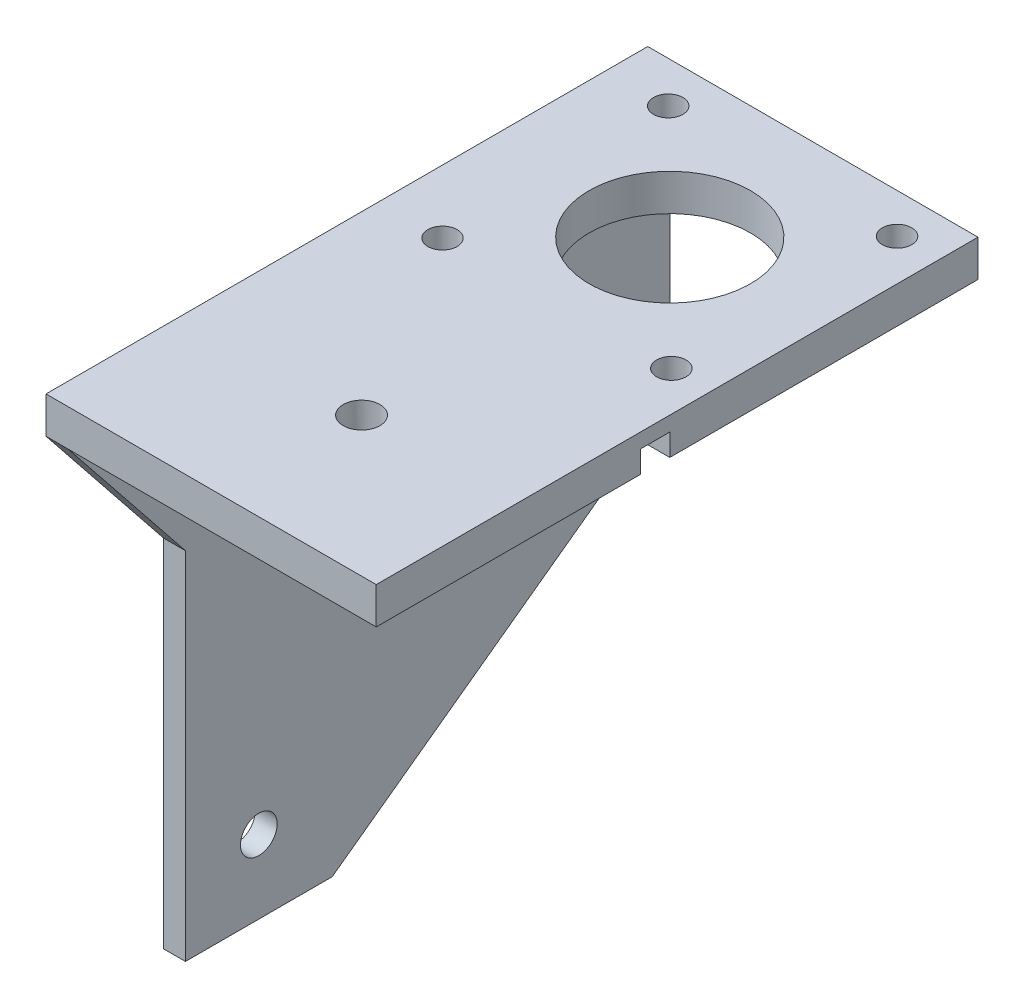
ISO-10303-21;
HEADER;
FILE_DESCRIPTION(('STEP AP214'),'2;1');
FILE_NAME('part.step','',(''),(''),'','','');
FILE_SCHEMA(('AUTOMOTIVE_DESIGN { 1 0 10303 214 1 1 1 1 }'));
ENDSEC;
DATA;
#1=APPLICATION_CONTEXT('core data for automotive mechanical design processes');
#2=APPLICATION_PROTOCOL_DEFINITION('international standard','automotive_design',2000,#1);
#3=PRODUCT_CONTEXT('',#1,'mechanical');
#4=PRODUCT('Part','Part','',(#3));
#5=PRODUCT_RELATED_PRODUCT_CATEGORY('part','',(#4));
#6=PRODUCT_DEFINITION_FORMATION('','',#4);
#7=PRODUCT_DEFINITION_CONTEXT('part definition',#1,'design');
#8=PRODUCT_DEFINITION('design','',#6,#7);
#9=PRODUCT_DEFINITION_SHAPE('','',#8);
#10=(LENGTH_UNIT() NAMED_UNIT(*) SI_UNIT(.MILLI.,.METRE.));
#11=(NAMED_UNIT(*) PLANE_ANGLE_UNIT() SI_UNIT($,.RADIAN.));
#12=(NAMED_UNIT(*) SI_UNIT($,.STERADIAN.) SOLID_ANGLE_UNIT());
#13=UNCERTAINTY_MEASURE_WITH_UNIT(LENGTH_MEASURE(1.E-05),#10,'distance_accuracy_value','');
#14=(GEOMETRIC_REPRESENTATION_CONTEXT(3) GLOBAL_UNCERTAINTY_ASSIGNED_CONTEXT((#13)) GLOBAL_UNIT_ASSIGNED_CONTEXT((#10,
#11,#12)) REPRESENTATION_CONTEXT('',''));
#15=CARTESIAN_POINT('',(0.,0.,0.));
#16=DIRECTION('',(0.,0.,1.));
#17=DIRECTION('',(1.,0.,0.));
#18=AXIS2_PLACEMENT_3D('',#15,#16,#17);
#19=CARTESIAN_POINT('',(0.,0.,-42.));
#20=DIRECTION('',(0.,-1.,0.));
#21=DIRECTION('',(0.,0.,1.));
#22=AXIS2_PLACEMENT_3D('',#19,#20,#21);
#23=PLANE('',#22);
#24=DIRECTION('',(-1.,0.,0.));
#25=VECTOR('',#24,1.);
#26=CARTESIAN_POINT('',(-21.,0.,-17.));
#27=LINE('',#26,#25);
#28=CARTESIAN_POINT('',(21.,0.,-17.));
#29=VERTEX_POINT('',#28);
#30=CARTESIAN_POINT('',(-21.,0.,-17.));
#31=VERTEX_POINT('',#30);
#32=EDGE_CURVE('E157',#29,#31,#27,.T.);
#33=ORIENTED_EDGE('',*,*,#32,.F.);
#34=DIRECTION('',(0.,0.,1.));
#35=VECTOR('',#34,1.);
#36=CARTESIAN_POINT('',(21.,0.,-63.));
#37=LINE('',#36,#35);
#38=CARTESIAN_POINT('',(21.,0.,19.));
#39=VERTEX_POINT('',#38);
#40=EDGE_CURVE('E83',#29,#39,#37,.T.);
#41=ORIENTED_EDGE('',*,*,#40,.T.);
#42=DIRECTION('',(1.,0.,0.));
#43=VECTOR('',#42,1.);
#44=CARTESIAN_POINT('',(-21.,0.,19.));
#45=LINE('',#44,#43);
#46=CARTESIAN_POINT('',(-21.,0.,19.));
#47=VERTEX_POINT('',#46);
#48=EDGE_CURVE('E220',#47,#39,#45,.T.);
#49=ORIENTED_EDGE('',*,*,#48,.F.);
#50=DIRECTION('',(0.,0.,-1.));
#51=VECTOR('',#50,1.);
#52=CARTESIAN_POINT('',(-21.,0.,-63.));
#53=LINE('',#52,#51);
#54=EDGE_CURVE('E263',#47,#31,#53,.T.);
#55=ORIENTED_EDGE('',*,*,#54,.T.);
#56=EDGE_LOOP('',(#33,#41,#49,#55));
#57=FACE_BOUND('',#56,.T.);
#58=CARTESIAN_POINT('',(0.,0.,0.));
#59=DIRECTION('',(0.,-1.,0.));
#60=DIRECTION('',(0.,0.,-1.));
#61=AXIS2_PLACEMENT_3D('',#58,#59,#60);
#62=CIRCLE('',#61,2.5);
#63=CARTESIAN_POINT('',(0.,0.,-2.5));
#64=VERTEX_POINT('',#63);
#65=EDGE_CURVE('E168',#64,#64,#62,.T.);
#66=ORIENTED_EDGE('',*,*,#65,.F.);
#67=EDGE_LOOP('',(#66));
#68=FACE_BOUND('',#67,.T.);
#69=ADVANCED_FACE('F34',(#57,#68),#23,.T.);
#70=CARTESIAN_POINT('',(0.,5.,-42.));
#71=DIRECTION('',(0.,-1.,0.));
#72=DIRECTION('',(0.,0.,1.));
#73=AXIS2_PLACEMENT_3D('',#70,#71,#72);
#74=PLANE('',#73);
#75=CARTESIAN_POINT('',(0.,5.,0.));
#76=DIRECTION('',(0.,1.,0.));
#77=DIRECTION('',(0.,0.,1.));
#78=AXIS2_PLACEMENT_3D('',#75,#76,#77);
#79=CIRCLE('',#78,2.5);
#80=CARTESIAN_POINT('',(0.,5.,2.5));
#81=VERTEX_POINT('',#80);
#82=EDGE_CURVE('E164',#81,#81,#79,.T.);
#83=ORIENTED_EDGE('',*,*,#82,.F.);
#84=EDGE_LOOP('',(#83));
#85=FACE_BOUND('',#84,.T.);
#86=DIRECTION('',(0.,0.,1.));
#87=VECTOR('',#86,1.);
#88=CARTESIAN_POINT('',(21.,5.,-63.));
#89=LINE('',#88,#87);
#90=CARTESIAN_POINT('',(21.,5.,-63.));
#91=VERTEX_POINT('',#90);
#92=CARTESIAN_POINT('',(21.,5.,19.));
#93=VERTEX_POINT('',#92);
#94=EDGE_CURVE('E75',#91,#93,#89,.T.);
#95=ORIENTED_EDGE('',*,*,#94,.F.);
#96=DIRECTION('',(1.,0.,0.));
#97=VECTOR('',#96,1.);
#98=CARTESIAN_POINT('',(-21.,5.,-63.));
#99=LINE('',#98,#97);
#100=CARTESIAN_POINT('',(-24.,5.,-63.));
#101=VERTEX_POINT('',#100);
#102=EDGE_CURVE('E257',#101,#91,#99,.T.);
#103=ORIENTED_EDGE('',*,*,#102,.F.);
#104=DIRECTION('',(0.,0.,-1.));
#105=VECTOR('',#104,1.);
#106=CARTESIAN_POINT('',(-24.,5.,19.));
#107=LINE('',#106,#105);
#108=CARTESIAN_POINT('',(-24.,5.,19.));
#109=VERTEX_POINT('',#108);
#110=EDGE_CURVE('E177',#109,#101,#107,.T.);
#111=ORIENTED_EDGE('',*,*,#110,.F.);
#112=DIRECTION('',(-1.,0.,0.));
#113=VECTOR('',#112,1.);
#114=CARTESIAN_POINT('',(-21.,5.,19.));
#115=LINE('',#114,#113);
#116=EDGE_CURVE('E224',#93,#109,#115,.T.);
#117=ORIENTED_EDGE('',*,*,#116,.F.);
#118=EDGE_LOOP('',(#95,#103,#111,#117));
#119=FACE_BOUND('',#118,.T.);
#120=CARTESIAN_POINT('',(0.,5.,-42.));
#121=DIRECTION('',(0.,-1.,0.));
#122=DIRECTION('',(0.,0.,-1.));
#123=AXIS2_PLACEMENT_3D('',#120,#121,#122);
#124=CIRCLE('',#123,11.);
#125=CARTESIAN_POINT('',(0.,5.,-53.));
#126=VERTEX_POINT('',#125);
#127=EDGE_CURVE('E251',#126,#126,#124,.T.);
#128=ORIENTED_EDGE('',*,*,#127,.T.);
#129=EDGE_LOOP('',(#128));
#130=FACE_BOUND('',#129,.T.);
#131=CARTESIAN_POINT('',(-15.592519129157,5.,-57.3780150606921));
#132=DIRECTION('',(0.,-1.,0.));
#133=DIRECTION('',(0.,0.,-1.));
#134=AXIS2_PLACEMENT_3D('',#131,#132,#133);
#135=CIRCLE('',#134,2.);
#136=CARTESIAN_POINT('',(-15.592519129157,5.,-59.3780150606921));
#137=VERTEX_POINT('',#136);
#138=EDGE_CURVE('E245',#137,#137,#135,.T.);
#139=ORIENTED_EDGE('',*,*,#138,.T.);
#140=EDGE_LOOP('',(#139));
#141=FACE_BOUND('',#140,.T.);
#142=CARTESIAN_POINT('',(-15.3780150606921,5.,-26.407480870843));
#143=DIRECTION('',(0.,-1.,0.));
#144=DIRECTION('',(0.,0.,-1.));
#145=AXIS2_PLACEMENT_3D('',#142,#143,#144);
#146=CIRCLE('',#145,2.);
#147=CARTESIAN_POINT('',(-15.3780150606921,5.,-28.407480870843));
#148=VERTEX_POINT('',#147);
#149=EDGE_CURVE('E239',#148,#148,#146,.T.);
#150=ORIENTED_EDGE('',*,*,#149,.T.);
#151=EDGE_LOOP('',(#150));
#152=FACE_BOUND('',#151,.T.);
#153=CARTESIAN_POINT('',(15.592519129157,5.,-26.6219849393079));
#154=DIRECTION('',(0.,-1.,0.));
#155=DIRECTION('',(0.,0.,-1.));
#156=AXIS2_PLACEMENT_3D('',#153,#154,#155);
#157=CIRCLE('',#156,2.);
#158=CARTESIAN_POINT('',(15.592519129157,5.,-28.6219849393079));
#159=VERTEX_POINT('',#158);
#160=EDGE_CURVE('E233',#159,#159,#157,.T.);
#161=ORIENTED_EDGE('',*,*,#160,.T.);
#162=EDGE_LOOP('',(#161));
#163=FACE_BOUND('',#162,.T.);
#164=CARTESIAN_POINT('',(15.3780150606921,5.,-57.592519129157));
#165=DIRECTION('',(0.,-1.,0.));
#166=DIRECTION('',(0.,0.,-1.));
#167=AXIS2_PLACEMENT_3D('',#164,#165,#166);
#168=CIRCLE('',#167,2.);
#169=CARTESIAN_POINT('',(15.3780150606921,5.,-59.592519129157));
#170=VERTEX_POINT('',#169);
#171=EDGE_CURVE('E227',#170,#170,#168,.T.);
#172=ORIENTED_EDGE('',*,*,#171,.T.);
#173=EDGE_LOOP('',(#172));
#174=FACE_BOUND('',#173,.T.);
#175=ADVANCED_FACE('F285',(#85,#119,#130,#141,#152,#163,#174),#74,.F.);
#176=DIRECTION('',(1.,0.,0.));
#177=VECTOR('',#176,1.);
#178=CARTESIAN_POINT('',(-21.,0.,-21.));
#179=LINE('',#178,#177);
#180=CARTESIAN_POINT('',(-21.,0.,-21.));
#181=VERTEX_POINT('',#180);
#182=CARTESIAN_POINT('',(21.,0.,-21.));
#183=VERTEX_POINT('',#182);
#184=EDGE_CURVE('E159',#181,#183,#179,.T.);
#185=ORIENTED_EDGE('',*,*,#184,.F.);
#186=CARTESIAN_POINT('',(-21.,0.,-63.));
#187=VERTEX_POINT('',#186);
#188=EDGE_CURVE('E70',#181,#187,#53,.T.);
#189=ORIENTED_EDGE('',*,*,#188,.T.);
#190=DIRECTION('',(1.,0.,0.));
#191=VECTOR('',#190,1.);
#192=CARTESIAN_POINT('',(-21.,0.,-63.));
#193=LINE('',#192,#191);
#194=CARTESIAN_POINT('',(21.,0.,-63.));
#195=VERTEX_POINT('',#194);
#196=EDGE_CURVE('E258',#187,#195,#193,.T.);
#197=ORIENTED_EDGE('',*,*,#196,.T.);
#198=EDGE_CURVE('E260',#195,#183,#37,.T.);
#199=ORIENTED_EDGE('',*,*,#198,.T.);
#200=EDGE_LOOP('',(#185,#189,#197,#199));
#201=FACE_BOUND('',#200,.T.);
#202=CARTESIAN_POINT('',(15.592519129157,0.,-26.6219849393079));
#203=DIRECTION('',(0.,-1.,0.));
#204=DIRECTION('',(0.,0.,-1.));
#205=AXIS2_PLACEMENT_3D('',#202,#203,#204);
#206=CIRCLE('',#205,2.);
#207=CARTESIAN_POINT('',(15.592519129157,0.,-28.6219849393079));
#208=VERTEX_POINT('',#207);
#209=EDGE_CURVE('E230',#208,#208,#206,.T.);
#210=ORIENTED_EDGE('',*,*,#209,.F.);
#211=EDGE_LOOP('',(#210));
#212=FACE_BOUND('',#211,.T.);
#213=CARTESIAN_POINT('',(-15.592519129157,0.,-57.3780150606921));
#214=DIRECTION('',(0.,-1.,0.));
#215=DIRECTION('',(0.,0.,-1.));
#216=AXIS2_PLACEMENT_3D('',#213,#214,#215);
#217=CIRCLE('',#216,2.);
#218=CARTESIAN_POINT('',(-15.592519129157,0.,-59.3780150606921));
#219=VERTEX_POINT('',#218);
#220=EDGE_CURVE('E242',#219,#219,#217,.T.);
#221=ORIENTED_EDGE('',*,*,#220,.F.);
#222=EDGE_LOOP('',(#221));
#223=FACE_BOUND('',#222,.T.);
#224=CARTESIAN_POINT('',(0.,0.,-42.));
#225=DIRECTION('',(0.,-1.,0.));
#226=DIRECTION('',(0.,0.,-1.));
#227=AXIS2_PLACEMENT_3D('',#224,#225,#226);
#228=CIRCLE('',#227,11.);
#229=CARTESIAN_POINT('',(0.,0.,-53.));
#230=VERTEX_POINT('',#229);
#231=EDGE_CURVE('E248',#230,#230,#228,.T.);
#232=ORIENTED_EDGE('',*,*,#231,.F.);
#233=EDGE_LOOP('',(#232));
#234=FACE_BOUND('',#233,.T.);
#235=CARTESIAN_POINT('',(-15.3780150606921,0.,-26.407480870843));
#236=DIRECTION('',(0.,-1.,0.));
#237=DIRECTION('',(0.,0.,-1.));
#238=AXIS2_PLACEMENT_3D('',#235,#236,#237);
#239=CIRCLE('',#238,2.);
#240=CARTESIAN_POINT('',(-15.3780150606921,0.,-28.407480870843));
#241=VERTEX_POINT('',#240);
#242=EDGE_CURVE('E236',#241,#241,#239,.T.);
#243=ORIENTED_EDGE('',*,*,#242,.F.);
#244=EDGE_LOOP('',(#243));
#245=FACE_BOUND('',#244,.T.);
#246=CARTESIAN_POINT('',(15.3780150606921,0.,-57.592519129157));
#247=DIRECTION('',(0.,-1.,0.));
#248=DIRECTION('',(0.,0.,-1.));
#249=AXIS2_PLACEMENT_3D('',#246,#247,#248);
#250=CIRCLE('',#249,2.);
#251=CARTESIAN_POINT('',(15.3780150606921,0.,-59.592519129157));
#252=VERTEX_POINT('',#251);
#253=EDGE_CURVE('E226',#252,#252,#250,.T.);
#254=ORIENTED_EDGE('',*,*,#253,.F.);
#255=EDGE_LOOP('',(#254));
#256=FACE_BOUND('',#255,.T.);
#257=ADVANCED_FACE('F275',(#201,#212,#223,#234,#245,#256),#23,.T.);
#258=CARTESIAN_POINT('',(21.,5.,-63.));
#259=DIRECTION('',(-1.,0.,0.));
#260=DIRECTION('',(0.,0.,-1.));
#261=AXIS2_PLACEMENT_3D('',#258,#259,#260);
#262=PLANE('',#261);
#263=ORIENTED_EDGE('',*,*,#40,.F.);
#264=DIRECTION('',(0.,1.,0.));
#265=VECTOR('',#264,1.);
#266=CARTESIAN_POINT('',(21.,5.,-17.));
#267=LINE('',#266,#265);
#268=CARTESIAN_POINT('',(21.,3.,-17.));
#269=VERTEX_POINT('',#268);
#270=EDGE_CURVE('E11',#29,#269,#267,.T.);
#271=ORIENTED_EDGE('',*,*,#270,.T.);
#272=DIRECTION('',(0.,0.,-1.));
#273=VECTOR('',#272,1.);
#274=CARTESIAN_POINT('',(21.,3.,-63.));
#275=LINE('',#274,#273);
#276=CARTESIAN_POINT('',(21.,3.,-21.));
#277=VERTEX_POINT('',#276);
#278=EDGE_CURVE('E268',#269,#277,#275,.T.);
#279=ORIENTED_EDGE('',*,*,#278,.T.);
#280=DIRECTION('',(0.,-1.,0.));
#281=VECTOR('',#280,1.);
#282=CARTESIAN_POINT('',(21.,5.,-21.));
#283=LINE('',#282,#281);
#284=EDGE_CURVE('E42',#277,#183,#283,.T.);
#285=ORIENTED_EDGE('',*,*,#284,.T.);
#286=ORIENTED_EDGE('',*,*,#198,.F.);
#287=DIRECTION('',(0.,-1.,0.));
#288=VECTOR('',#287,1.);
#289=CARTESIAN_POINT('',(21.,5.,-63.));
#290=LINE('',#289,#288);
#291=EDGE_CURVE('E58',#91,#195,#290,.T.);
#292=ORIENTED_EDGE('',*,*,#291,.F.);
#293=ORIENTED_EDGE('',*,*,#94,.T.);
#294=DIRECTION('',(0.,1.,0.));
#295=VECTOR('',#294,1.);
#296=CARTESIAN_POINT('',(21.,5.,19.));
#297=LINE('',#296,#295);
#298=EDGE_CURVE('E222',#39,#93,#297,.T.);
#299=ORIENTED_EDGE('',*,*,#298,.F.);
#300=EDGE_LOOP('',(#263,#271,#279,#285,#286,#292,#293,#299));
#301=FACE_BOUND('',#300,.T.);
#302=ADVANCED_FACE('F36',(#301),#262,.F.);
#303=CARTESIAN_POINT('',(-21.,5.,-63.));
#304=DIRECTION('',(0.,0.,1.));
#305=DIRECTION('',(-1.,0.,0.));
#306=AXIS2_PLACEMENT_3D('',#303,#304,#305);
#307=PLANE('',#306);
#308=ORIENTED_EDGE('',*,*,#196,.F.);
#309=DIRECTION('',(0.,-1.,0.));
#310=VECTOR('',#309,1.);
#311=CARTESIAN_POINT('',(-21.,5.,-63.));
#312=LINE('',#311,#310);
#313=CARTESIAN_POINT('',(-21.,-35.,-63.));
#314=VERTEX_POINT('',#313);
#315=EDGE_CURVE('E195',#187,#314,#312,.T.);
#316=ORIENTED_EDGE('',*,*,#315,.T.);
#317=DIRECTION('',(1.,0.,0.));
#318=VECTOR('',#317,1.);
#319=CARTESIAN_POINT('',(-24.,-35.,-63.));
#320=LINE('',#319,#318);
#321=CARTESIAN_POINT('',(-24.,-35.,-63.));
#322=VERTEX_POINT('',#321);
#323=EDGE_CURVE('E217',#322,#314,#320,.T.);
#324=ORIENTED_EDGE('',*,*,#323,.F.);
#325=DIRECTION('',(0.,-1.,0.));
#326=VECTOR('',#325,1.);
#327=CARTESIAN_POINT('',(-24.,5.,-63.));
#328=LINE('',#327,#326);
#329=EDGE_CURVE('E180',#101,#322,#328,.T.);
#330=ORIENTED_EDGE('',*,*,#329,.F.);
#331=ORIENTED_EDGE('',*,*,#102,.T.);
#332=ORIENTED_EDGE('',*,*,#291,.T.);
#333=EDGE_LOOP('',(#308,#316,#324,#330,#331,#332));
#334=FACE_BOUND('',#333,.T.);
#335=ADVANCED_FACE('F279',(#334),#307,.F.);
#336=CARTESIAN_POINT('',(0.,5.,-42.));
#337=DIRECTION('',(0.,-1.,0.));
#338=DIRECTION('',(0.,0.,1.));
#339=AXIS2_PLACEMENT_3D('',#336,#337,#338);
#340=CYLINDRICAL_SURFACE('',#339,11.);
#341=ORIENTED_EDGE('',*,*,#127,.F.);
#342=EDGE_LOOP('',(#341));
#343=FACE_BOUND('',#342,.T.);
#344=ORIENTED_EDGE('',*,*,#231,.T.);
#345=EDGE_LOOP('',(#344));
#346=FACE_BOUND('',#345,.T.);
#347=ADVANCED_FACE('F334',(#343,#346),#340,.F.);
#348=CARTESIAN_POINT('',(-15.592519129157,5.,-57.3780150606921));
#349=DIRECTION('',(0.,-1.,0.));
#350=DIRECTION('',(0.,0.,1.));
#351=AXIS2_PLACEMENT_3D('',#348,#349,#350);
#352=CYLINDRICAL_SURFACE('',#351,2.);
#353=ORIENTED_EDGE('',*,*,#138,.F.);
#354=EDGE_LOOP('',(#353));
#355=FACE_BOUND('',#354,.T.);
#356=ORIENTED_EDGE('',*,*,#220,.T.);
#357=EDGE_LOOP('',(#356));
#358=FACE_BOUND('',#357,.T.);
#359=ADVANCED_FACE('F340',(#355,#358),#352,.F.);
#360=CARTESIAN_POINT('',(-15.3780150606921,5.,-26.407480870843));
#361=DIRECTION('',(0.,-1.,0.));
#362=DIRECTION('',(0.,0.,1.));
#363=AXIS2_PLACEMENT_3D('',#360,#361,#362);
#364=CYLINDRICAL_SURFACE('',#363,2.);
#365=ORIENTED_EDGE('',*,*,#149,.F.);
#366=EDGE_LOOP('',(#365));
#367=FACE_BOUND('',#366,.T.);
#368=ORIENTED_EDGE('',*,*,#242,.T.);
#369=EDGE_LOOP('',(#368));
#370=FACE_BOUND('',#369,.T.);
#371=ADVANCED_FACE('F346',(#367,#370),#364,.F.);
#372=CARTESIAN_POINT('',(15.592519129157,5.,-26.6219849393079));
#373=DIRECTION('',(0.,-1.,0.));
#374=DIRECTION('',(0.,0.,1.));
#375=AXIS2_PLACEMENT_3D('',#372,#373,#374);
#376=CYLINDRICAL_SURFACE('',#375,2.);
#377=ORIENTED_EDGE('',*,*,#160,.F.);
#378=EDGE_LOOP('',(#377));
#379=FACE_BOUND('',#378,.T.);
#380=ORIENTED_EDGE('',*,*,#209,.T.);
#381=EDGE_LOOP('',(#380));
#382=FACE_BOUND('',#381,.T.);
#383=ADVANCED_FACE('F354',(#379,#382),#376,.F.);
#384=CARTESIAN_POINT('',(15.3780150606921,5.,-57.592519129157));
#385=DIRECTION('',(0.,-1.,0.));
#386=DIRECTION('',(0.,0.,1.));
#387=AXIS2_PLACEMENT_3D('',#384,#385,#386);
#388=CYLINDRICAL_SURFACE('',#387,2.);
#389=ORIENTED_EDGE('',*,*,#171,.F.);
#390=EDGE_LOOP('',(#389));
#391=FACE_BOUND('',#390,.T.);
#392=ORIENTED_EDGE('',*,*,#253,.T.);
#393=EDGE_LOOP('',(#392));
#394=FACE_BOUND('',#393,.T.);
#395=ADVANCED_FACE('F358',(#391,#394),#388,.F.);
#396=CARTESIAN_POINT('',(0.,0.,19.));
#397=DIRECTION('',(0.,0.,1.));
#398=DIRECTION('',(1.,0.,0.));
#399=AXIS2_PLACEMENT_3D('',#396,#397,#398);
#400=PLANE('',#399);
#401=ORIENTED_EDGE('',*,*,#116,.T.);
#402=DIRECTION('',(0.,1.,0.));
#403=VECTOR('',#402,1.);
#404=CARTESIAN_POINT('',(-24.,0.,19.));
#405=LINE('',#404,#403);
#406=CARTESIAN_POINT('',(-24.,0.,19.));
#407=VERTEX_POINT('',#406);
#408=EDGE_CURVE('E191',#407,#109,#405,.T.);
#409=ORIENTED_EDGE('',*,*,#408,.F.);
#410=DIRECTION('',(1.,0.,0.));
#411=VECTOR('',#410,1.);
#412=CARTESIAN_POINT('',(-24.,0.,19.));
#413=LINE('',#412,#411);
#414=EDGE_CURVE('E194',#407,#47,#413,.T.);
#415=ORIENTED_EDGE('',*,*,#414,.T.);
#416=ORIENTED_EDGE('',*,*,#48,.T.);
#417=ORIENTED_EDGE('',*,*,#298,.T.);
#418=EDGE_LOOP('',(#401,#409,#415,#416,#417));
#419=FACE_BOUND('',#418,.T.);
#420=ADVANCED_FACE('F289',(#419),#400,.T.);
#421=CARTESIAN_POINT('',(-24.,-35.,-63.));
#422=DIRECTION('',(0.,0.808520963920778,0.588467374542222));
#423=DIRECTION('',(0.,-0.588467374542222,0.808520963920778));
#424=AXIS2_PLACEMENT_3D('',#421,#422,#423);
#425=PLANE('',#424);
#426=DIRECTION('',(0.,-0.588467374542222,0.808520963920778));
#427=VECTOR('',#426,1.);
#428=CARTESIAN_POINT('',(-21.,-35.,-63.));
#429=LINE('',#428,#427);
#430=CARTESIAN_POINT('',(-21.,-68.4802688327011,-16.9999999999999));
#431=VERTEX_POINT('',#430);
#432=EDGE_CURVE('E197',#314,#431,#429,.T.);
#433=ORIENTED_EDGE('',*,*,#432,.T.);
#434=DIRECTION('',(1.,0.,0.));
#435=VECTOR('',#434,1.);
#436=CARTESIAN_POINT('',(-24.,-68.4802688327011,-16.9999999999999));
#437=LINE('',#436,#435);
#438=CARTESIAN_POINT('',(-24.,-68.4802688327011,-16.9999999999999));
#439=VERTEX_POINT('',#438);
#440=EDGE_CURVE('E214',#439,#431,#437,.T.);
#441=ORIENTED_EDGE('',*,*,#440,.F.);
#442=DIRECTION('',(0.,-0.588467374542222,0.808520963920778));
#443=VECTOR('',#442,1.);
#444=CARTESIAN_POINT('',(-24.,-35.,-63.));
#445=LINE('',#444,#443);
#446=EDGE_CURVE('E183',#322,#439,#445,.T.);
#447=ORIENTED_EDGE('',*,*,#446,.F.);
#448=ORIENTED_EDGE('',*,*,#323,.T.);
#449=EDGE_LOOP('',(#433,#441,#447,#448));
#450=FACE_BOUND('',#449,.T.);
#451=ADVANCED_FACE('F316',(#450),#425,.F.);
#452=CARTESIAN_POINT('',(-24.,-68.4802688327011,-16.9999999999999));
#453=DIRECTION('',(0.,1.,0.));
#454=DIRECTION('',(0.,0.,1.));
#455=AXIS2_PLACEMENT_3D('',#452,#453,#454);
#456=PLANE('',#455);
#457=DIRECTION('',(0.,0.,1.));
#458=VECTOR('',#457,1.);
#459=CARTESIAN_POINT('',(-21.,-68.4802688327011,-16.9999999999999));
#460=LINE('',#459,#458);
#461=CARTESIAN_POINT('',(-21.,-68.4802688327011,3.00000000000007));
#462=VERTEX_POINT('',#461);
#463=EDGE_CURVE('E199',#431,#462,#460,.T.);
#464=ORIENTED_EDGE('',*,*,#463,.T.);
#465=DIRECTION('',(1.,0.,0.));
#466=VECTOR('',#465,1.);
#467=CARTESIAN_POINT('',(-24.,-68.4802688327011,3.00000000000007));
#468=LINE('',#467,#466);
#469=CARTESIAN_POINT('',(-24.,-68.4802688327011,3.00000000000007));
#470=VERTEX_POINT('',#469);
#471=EDGE_CURVE('E211',#470,#462,#468,.T.);
#472=ORIENTED_EDGE('',*,*,#471,.F.);
#473=DIRECTION('',(0.,0.,1.));
#474=VECTOR('',#473,1.);
#475=CARTESIAN_POINT('',(-24.,-68.4802688327011,-16.9999999999999));
#476=LINE('',#475,#474);
#477=EDGE_CURVE('E185',#439,#470,#476,.T.);
#478=ORIENTED_EDGE('',*,*,#477,.F.);
#479=ORIENTED_EDGE('',*,*,#440,.T.);
#480=EDGE_LOOP('',(#464,#472,#478,#479));
#481=FACE_BOUND('',#480,.T.);
#482=ADVANCED_FACE('F305',(#481),#456,.F.);
#483=CARTESIAN_POINT('',(-24.,-42.1563099903324,3.00000000000007));
#484=DIRECTION('',(0.,0.,-1.));
#485=DIRECTION('',(-1.,0.,0.));
#486=AXIS2_PLACEMENT_3D('',#483,#484,#485);
#487=PLANE('',#486);
#488=DIRECTION('',(0.,1.,0.));
#489=VECTOR('',#488,1.);
#490=CARTESIAN_POINT('',(-21.,-42.1563099903324,3.00000000000007));
#491=LINE('',#490,#489);
#492=CARTESIAN_POINT('',(-21.,-20.,3.00000000000007));
#493=VERTEX_POINT('',#492);
#494=EDGE_CURVE('E202',#462,#493,#491,.T.);
#495=ORIENTED_EDGE('',*,*,#494,.T.);
#496=DIRECTION('',(1.,0.,0.));
#497=VECTOR('',#496,1.);
#498=CARTESIAN_POINT('',(-24.,-20.,3.00000000000007));
#499=LINE('',#498,#497);
#500=CARTESIAN_POINT('',(-24.,-20.,3.00000000000007));
#501=VERTEX_POINT('',#500);
#502=EDGE_CURVE('E208',#501,#493,#499,.T.);
#503=ORIENTED_EDGE('',*,*,#502,.F.);
#504=DIRECTION('',(0.,1.,0.));
#505=VECTOR('',#504,1.);
#506=CARTESIAN_POINT('',(-24.,-68.4802688327011,3.00000000000007));
#507=LINE('',#506,#505);
#508=EDGE_CURVE('E187',#470,#501,#507,.T.);
#509=ORIENTED_EDGE('',*,*,#508,.F.);
#510=ORIENTED_EDGE('',*,*,#471,.T.);
#511=EDGE_LOOP('',(#495,#503,#509,#510));
#512=FACE_BOUND('',#511,.T.);
#513=ADVANCED_FACE('F308',(#512),#487,.F.);
#514=CARTESIAN_POINT('',(-24.,-20.,3.00000000000007));
#515=DIRECTION('',(0.,0.624695047554422,-0.780868809443032));
#516=DIRECTION('',(0.,0.780868809443032,0.624695047554422));
#517=AXIS2_PLACEMENT_3D('',#514,#515,#516);
#518=PLANE('',#517);
#519=DIRECTION('',(0.,0.780868809443032,0.624695047554422));
#520=VECTOR('',#519,1.);
#521=CARTESIAN_POINT('',(-21.,-20.,3.00000000000007));
#522=LINE('',#521,#520);
#523=EDGE_CURVE('E181',#493,#47,#522,.T.);
#524=ORIENTED_EDGE('',*,*,#523,.T.);
#525=ORIENTED_EDGE('',*,*,#414,.F.);
#526=DIRECTION('',(0.,0.780868809443032,0.624695047554422));
#527=VECTOR('',#526,1.);
#528=CARTESIAN_POINT('',(-24.,-20.,3.00000000000007));
#529=LINE('',#528,#527);
#530=EDGE_CURVE('E189',#501,#407,#529,.T.);
#531=ORIENTED_EDGE('',*,*,#530,.F.);
#532=ORIENTED_EDGE('',*,*,#502,.T.);
#533=EDGE_LOOP('',(#524,#525,#531,#532));
#534=FACE_BOUND('',#533,.T.);
#535=ADVANCED_FACE('F297',(#534),#518,.F.);
#536=CARTESIAN_POINT('',(-24.,0.,0.));
#537=DIRECTION('',(-1.,0.,0.));
#538=DIRECTION('',(0.,0.,1.));
#539=AXIS2_PLACEMENT_3D('',#536,#537,#538);
#540=PLANE('',#539);
#541=CARTESIAN_POINT('',(-24.,-58.4802688327011,-6.99999999999993));
#542=DIRECTION('',(-1.,0.,0.));
#543=DIRECTION('',(0.,0.,1.));
#544=AXIS2_PLACEMENT_3D('',#541,#542,#543);
#545=CIRCLE('',#544,2.5);
#546=CARTESIAN_POINT('',(-24.,-58.4802688327011,-4.49999999999993));
#547=VERTEX_POINT('',#546);
#548=EDGE_CURVE('E169',#547,#547,#545,.T.);
#549=ORIENTED_EDGE('',*,*,#548,.F.);
#550=EDGE_LOOP('',(#549));
#551=FACE_BOUND('',#550,.T.);
#552=CARTESIAN_POINT('',(-24.,-15.,-6.99999999999993));
#553=DIRECTION('',(-1.,0.,0.));
#554=DIRECTION('',(0.,0.,1.));
#555=AXIS2_PLACEMENT_3D('',#552,#553,#554);
#556=CIRCLE('',#555,2.5);
#557=CARTESIAN_POINT('',(-24.,-15.,-4.49999999999993));
#558=VERTEX_POINT('',#557);
#559=EDGE_CURVE('E173',#558,#558,#556,.T.);
#560=ORIENTED_EDGE('',*,*,#559,.F.);
#561=EDGE_LOOP('',(#560));
#562=FACE_BOUND('',#561,.T.);
#563=ORIENTED_EDGE('',*,*,#110,.T.);
#564=ORIENTED_EDGE('',*,*,#329,.T.);
#565=ORIENTED_EDGE('',*,*,#446,.T.);
#566=ORIENTED_EDGE('',*,*,#477,.T.);
#567=ORIENTED_EDGE('',*,*,#508,.T.);
#568=ORIENTED_EDGE('',*,*,#530,.T.);
#569=ORIENTED_EDGE('',*,*,#408,.T.);
#570=EDGE_LOOP('',(#563,#564,#565,#566,#567,#568,#569));
#571=FACE_BOUND('',#570,.T.);
#572=ADVANCED_FACE('F291',(#551,#562,#571),#540,.T.);
#573=CARTESIAN_POINT('',(-21.,0.,0.));
#574=DIRECTION('',(-1.,0.,0.));
#575=DIRECTION('',(0.,0.,1.));
#576=AXIS2_PLACEMENT_3D('',#573,#574,#575);
#577=PLANE('',#576);
#578=CARTESIAN_POINT('',(-21.,-58.4802688327011,-6.99999999999993));
#579=DIRECTION('',(-1.,0.,0.));
#580=DIRECTION('',(0.,0.,1.));
#581=AXIS2_PLACEMENT_3D('',#578,#579,#580);
#582=CIRCLE('',#581,2.5);
#583=CARTESIAN_POINT('',(-21.,-58.4802688327011,-4.49999999999993));
#584=VERTEX_POINT('',#583);
#585=EDGE_CURVE('E172',#584,#584,#582,.T.);
#586=ORIENTED_EDGE('',*,*,#585,.T.);
#587=EDGE_LOOP('',(#586));
#588=FACE_BOUND('',#587,.T.);
#589=CARTESIAN_POINT('',(-21.,-15.,-6.99999999999993));
#590=DIRECTION('',(-1.,0.,0.));
#591=DIRECTION('',(0.,0.,1.));
#592=AXIS2_PLACEMENT_3D('',#589,#590,#591);
#593=CIRCLE('',#592,2.5);
#594=CARTESIAN_POINT('',(-21.,-15.,-4.49999999999993));
#595=VERTEX_POINT('',#594);
#596=EDGE_CURVE('E176',#595,#595,#593,.T.);
#597=ORIENTED_EDGE('',*,*,#596,.T.);
#598=EDGE_LOOP('',(#597));
#599=FACE_BOUND('',#598,.T.);
#600=ORIENTED_EDGE('',*,*,#54,.F.);
#601=ORIENTED_EDGE('',*,*,#523,.F.);
#602=ORIENTED_EDGE('',*,*,#494,.F.);
#603=ORIENTED_EDGE('',*,*,#463,.F.);
#604=ORIENTED_EDGE('',*,*,#432,.F.);
#605=ORIENTED_EDGE('',*,*,#315,.F.);
#606=ORIENTED_EDGE('',*,*,#188,.F.);
#607=DIRECTION('',(0.,-1.,0.));
#608=VECTOR('',#607,1.);
#609=CARTESIAN_POINT('',(-21.,3.,-21.));
#610=LINE('',#609,#608);
#611=CARTESIAN_POINT('',(-21.,3.,-21.));
#612=VERTEX_POINT('',#611);
#613=EDGE_CURVE('E140',#612,#181,#610,.T.);
#614=ORIENTED_EDGE('',*,*,#613,.F.);
#615=DIRECTION('',(0.,0.,-1.));
#616=VECTOR('',#615,1.);
#617=CARTESIAN_POINT('',(-21.,3.,-21.));
#618=LINE('',#617,#616);
#619=CARTESIAN_POINT('',(-21.,3.,-17.));
#620=VERTEX_POINT('',#619);
#621=EDGE_CURVE('E144',#620,#612,#618,.T.);
#622=ORIENTED_EDGE('',*,*,#621,.F.);
#623=DIRECTION('',(0.,-1.,0.));
#624=VECTOR('',#623,1.);
#625=CARTESIAN_POINT('',(-21.,3.,-17.));
#626=LINE('',#625,#624);
#627=EDGE_CURVE('E49',#620,#31,#626,.T.);
#628=ORIENTED_EDGE('',*,*,#627,.T.);
#629=EDGE_LOOP('',(#600,#601,#602,#603,#604,#605,#606,#614,#622,#628));
#630=FACE_BOUND('',#629,.T.);
#631=ADVANCED_FACE('F142',(#588,#599,#630),#577,.F.);
#632=CARTESIAN_POINT('',(-14.,-15.,-6.99999999999993));
#633=DIRECTION('',(-1.,0.,0.));
#634=DIRECTION('',(0.,0.,1.));
#635=AXIS2_PLACEMENT_3D('',#632,#633,#634);
#636=CYLINDRICAL_SURFACE('',#635,2.5);
#637=ORIENTED_EDGE('',*,*,#559,.T.);
#638=EDGE_LOOP('',(#637));
#639=FACE_BOUND('',#638,.T.);
#640=ORIENTED_EDGE('',*,*,#596,.F.);
#641=EDGE_LOOP('',(#640));
#642=FACE_BOUND('',#641,.T.);
#643=ADVANCED_FACE('F399',(#639,#642),#636,.F.);
#644=CARTESIAN_POINT('',(-14.,-58.4802688327011,-6.99999999999993));
#645=DIRECTION('',(-1.,0.,0.));
#646=DIRECTION('',(0.,0.,1.));
#647=AXIS2_PLACEMENT_3D('',#644,#645,#646);
#648=CYLINDRICAL_SURFACE('',#647,2.5);
#649=ORIENTED_EDGE('',*,*,#548,.T.);
#650=EDGE_LOOP('',(#649));
#651=FACE_BOUND('',#650,.T.);
#652=ORIENTED_EDGE('',*,*,#585,.F.);
#653=EDGE_LOOP('',(#652));
#654=FACE_BOUND('',#653,.T.);
#655=ADVANCED_FACE('F404',(#651,#654),#648,.F.);
#656=CARTESIAN_POINT('',(0.,-5.,0.));
#657=DIRECTION('',(0.,1.,0.));
#658=DIRECTION('',(0.,0.,1.));
#659=AXIS2_PLACEMENT_3D('',#656,#657,#658);
#660=CYLINDRICAL_SURFACE('',#659,2.5);
#661=ORIENTED_EDGE('',*,*,#65,.T.);
#662=EDGE_LOOP('',(#661));
#663=FACE_BOUND('',#662,.T.);
#664=ORIENTED_EDGE('',*,*,#82,.T.);
#665=EDGE_LOOP('',(#664));
#666=FACE_BOUND('',#665,.T.);
#667=ADVANCED_FACE('F415',(#663,#666),#660,.F.);
#668=CARTESIAN_POINT('',(-21.,3.,-17.));
#669=DIRECTION('',(0.,0.,1.));
#670=DIRECTION('',(1.,0.,0.));
#671=AXIS2_PLACEMENT_3D('',#668,#669,#670);
#672=PLANE('',#671);
#673=ORIENTED_EDGE('',*,*,#32,.T.);
#674=ORIENTED_EDGE('',*,*,#627,.F.);
#675=DIRECTION('',(-1.,0.,0.));
#676=VECTOR('',#675,1.);
#677=CARTESIAN_POINT('',(-21.,3.,-17.));
#678=LINE('',#677,#676);
#679=EDGE_CURVE('E146',#269,#620,#678,.T.);
#680=ORIENTED_EDGE('',*,*,#679,.F.);
#681=ORIENTED_EDGE('',*,*,#270,.F.);
#682=EDGE_LOOP('',(#673,#674,#680,#681));
#683=FACE_BOUND('',#682,.T.);
#684=ADVANCED_FACE('F427',(#683),#672,.F.);
#685=CARTESIAN_POINT('',(-21.,3.,-21.));
#686=DIRECTION('',(0.,0.,-1.));
#687=DIRECTION('',(-1.,0.,0.));
#688=AXIS2_PLACEMENT_3D('',#685,#686,#687);
#689=PLANE('',#688);
#690=DIRECTION('',(1.,0.,0.));
#691=VECTOR('',#690,1.);
#692=CARTESIAN_POINT('',(-21.,3.,-21.));
#693=LINE('',#692,#691);
#694=EDGE_CURVE('E149',#612,#277,#693,.T.);
#695=ORIENTED_EDGE('',*,*,#694,.F.);
#696=ORIENTED_EDGE('',*,*,#613,.T.);
#697=ORIENTED_EDGE('',*,*,#184,.T.);
#698=ORIENTED_EDGE('',*,*,#284,.F.);
#699=EDGE_LOOP('',(#695,#696,#697,#698));
#700=FACE_BOUND('',#699,.T.);
#701=ADVANCED_FACE('F150',(#700),#689,.F.);
#702=CARTESIAN_POINT('',(0.,3.,0.));
#703=DIRECTION('',(0.,1.,0.));
#704=DIRECTION('',(0.,0.,1.));
#705=AXIS2_PLACEMENT_3D('',#702,#703,#704);
#706=PLANE('',#705);
#707=ORIENTED_EDGE('',*,*,#679,.T.);
#708=ORIENTED_EDGE('',*,*,#621,.T.);
#709=ORIENTED_EDGE('',*,*,#694,.T.);
#710=ORIENTED_EDGE('',*,*,#278,.F.);
#711=EDGE_LOOP('',(#707,#708,#709,#710));
#712=FACE_BOUND('',#711,.T.);
#713=ADVANCED_FACE('F155',(#712),#706,.F.);
#714=CLOSED_SHELL('',(#69,#175,#257,#302,#335,#347,#359,#371,#383,#395,#420,#451,#482,#513,#535,
#572,#631,#643,#655,#667,#684,#701,#713));
#715=MANIFOLD_SOLID_BREP('B2',#714);
#716=ADVANCED_BREP_SHAPE_REPRESENTATION('',(#18,#715),#14);
#717=SHAPE_DEFINITION_REPRESENTATION(#9,#716);
ENDSEC;
END-ISO-10303-21;
